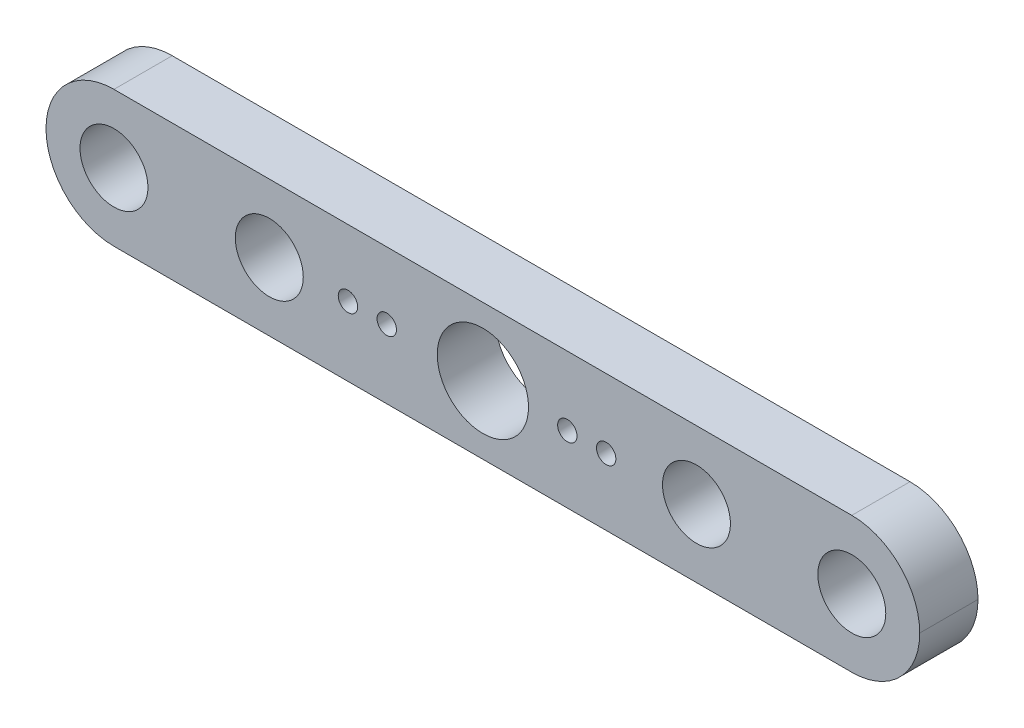
ISO-10303-21;
HEADER;
FILE_DESCRIPTION(('STEP AP214'),'2;1');
FILE_NAME('part.step','',(''),(''),'','','');
FILE_SCHEMA(('AUTOMOTIVE_DESIGN { 1 0 10303 214 1 1 1 1 }'));
ENDSEC;
DATA;
#1=APPLICATION_CONTEXT('core data for automotive mechanical design processes');
#2=APPLICATION_PROTOCOL_DEFINITION('international standard','automotive_design',2000,#1);
#3=PRODUCT_CONTEXT('',#1,'mechanical');
#4=PRODUCT('Part','Part','',(#3));
#5=PRODUCT_RELATED_PRODUCT_CATEGORY('part','',(#4));
#6=PRODUCT_DEFINITION_FORMATION('','',#4);
#7=PRODUCT_DEFINITION_CONTEXT('part definition',#1,'design');
#8=PRODUCT_DEFINITION('design','',#6,#7);
#9=PRODUCT_DEFINITION_SHAPE('','',#8);
#10=(LENGTH_UNIT() NAMED_UNIT(*) SI_UNIT(.MILLI.,.METRE.));
#11=(NAMED_UNIT(*) PLANE_ANGLE_UNIT() SI_UNIT($,.RADIAN.));
#12=(NAMED_UNIT(*) SI_UNIT($,.STERADIAN.) SOLID_ANGLE_UNIT());
#13=UNCERTAINTY_MEASURE_WITH_UNIT(LENGTH_MEASURE(1.E-05),#10,'distance_accuracy_value','');
#14=(GEOMETRIC_REPRESENTATION_CONTEXT(3) GLOBAL_UNCERTAINTY_ASSIGNED_CONTEXT((#13)) GLOBAL_UNIT_ASSIGNED_CONTEXT((#10,
#11,#12)) REPRESENTATION_CONTEXT('',''));
#15=CARTESIAN_POINT('',(0.,0.,0.));
#16=DIRECTION('',(0.,0.,1.));
#17=DIRECTION('',(1.,0.,0.));
#18=AXIS2_PLACEMENT_3D('',#15,#16,#17);
#19=CARTESIAN_POINT('',(0.,0.,0.));
#20=DIRECTION('',(0.,0.,1.));
#21=DIRECTION('',(1.,0.,0.));
#22=AXIS2_PLACEMENT_3D('',#19,#20,#21);
#23=PLANE('',#22);
#24=CARTESIAN_POINT('',(-4.84927563384823,24.1661612303614,0.));
#25=DIRECTION('',(0.,0.,1.));
#26=DIRECTION('',(1.,0.,0.));
#27=AXIS2_PLACEMENT_3D('',#24,#25,#26);
#28=CIRCLE('',#27,1.75);
#29=CARTESIAN_POINT('',(-3.09927563384823,24.1661612303614,0.));
#30=VERTEX_POINT('',#29);
#31=EDGE_CURVE('E160',#30,#30,#28,.T.);
#32=ORIENTED_EDGE('',*,*,#31,.T.);
#33=EDGE_LOOP('',(#32));
#34=FACE_BOUND('',#33,.T.);
#35=CARTESIAN_POINT('',(3.15072436615177,24.1661612303614,0.));
#36=DIRECTION('',(0.,0.,1.));
#37=DIRECTION('',(1.,0.,0.));
#38=AXIS2_PLACEMENT_3D('',#35,#36,#37);
#39=CIRCLE('',#38,3.5);
#40=CARTESIAN_POINT('',(3.15072436615177,27.6661612303614,0.));
#41=VERTEX_POINT('',#40);
#42=CARTESIAN_POINT('',(6.65072436615177,24.1661612303614,0.));
#43=VERTEX_POINT('',#42);
#44=EDGE_CURVE('E89',#41,#43,#39,.F.);
#45=ORIENTED_EDGE('',*,*,#44,.T.);
#46=CARTESIAN_POINT('',(3.15072436615177,24.1661612303614,0.));
#47=DIRECTION('',(0.,0.,1.));
#48=DIRECTION('',(1.,0.,0.));
#49=AXIS2_PLACEMENT_3D('',#46,#47,#48);
#50=CIRCLE('',#49,3.5);
#51=CARTESIAN_POINT('',(3.15072436615177,20.6661612303614,0.));
#52=VERTEX_POINT('',#51);
#53=EDGE_CURVE('E153',#43,#52,#50,.F.);
#54=ORIENTED_EDGE('',*,*,#53,.T.);
#55=DIRECTION('',(1.,0.,0.));
#56=VECTOR('',#55,1.);
#57=CARTESIAN_POINT('',(0.,20.6661612303614,0.));
#58=LINE('',#57,#56);
#59=CARTESIAN_POINT('',(-34.8492756338482,20.6661612303614,0.));
#60=VERTEX_POINT('',#59);
#61=EDGE_CURVE('E143',#60,#52,#58,.T.);
#62=ORIENTED_EDGE('',*,*,#61,.F.);
#63=CARTESIAN_POINT('',(-34.8492756338482,24.1661612303614,0.));
#64=DIRECTION('',(0.,0.,1.));
#65=DIRECTION('',(1.,0.,0.));
#66=AXIS2_PLACEMENT_3D('',#63,#64,#65);
#67=CIRCLE('',#66,3.5);
#68=CARTESIAN_POINT('',(-38.3492756338482,24.1661612303614,0.));
#69=VERTEX_POINT('',#68);
#70=EDGE_CURVE('E127',#60,#69,#67,.F.);
#71=ORIENTED_EDGE('',*,*,#70,.T.);
#72=CARTESIAN_POINT('',(-34.8492756338482,24.1661612303614,0.));
#73=DIRECTION('',(0.,0.,1.));
#74=DIRECTION('',(1.,0.,0.));
#75=AXIS2_PLACEMENT_3D('',#72,#73,#74);
#76=CIRCLE('',#75,3.5);
#77=CARTESIAN_POINT('',(-34.8492756338482,27.6661612303614,0.));
#78=VERTEX_POINT('',#77);
#79=EDGE_CURVE('E136',#69,#78,#76,.F.);
#80=ORIENTED_EDGE('',*,*,#79,.T.);
#81=DIRECTION('',(1.,0.,0.));
#82=VECTOR('',#81,1.);
#83=CARTESIAN_POINT('',(0.,27.6661612303614,0.));
#84=LINE('',#83,#82);
#85=EDGE_CURVE('E155',#78,#41,#84,.T.);
#86=ORIENTED_EDGE('',*,*,#85,.T.);
#87=EDGE_LOOP('',(#45,#54,#62,#71,#80,#86));
#88=FACE_BOUND('',#87,.T.);
#89=CARTESIAN_POINT('',(-26.8492756338482,24.1661612303614,0.));
#90=DIRECTION('',(0.,0.,1.));
#91=DIRECTION('',(1.,0.,0.));
#92=AXIS2_PLACEMENT_3D('',#89,#90,#91);
#93=CIRCLE('',#92,1.75);
#94=CARTESIAN_POINT('',(-25.0992756338482,24.1661612303614,0.));
#95=VERTEX_POINT('',#94);
#96=EDGE_CURVE('E156',#95,#95,#93,.T.);
#97=ORIENTED_EDGE('',*,*,#96,.T.);
#98=EDGE_LOOP('',(#97));
#99=FACE_BOUND('',#98,.T.);
#100=CARTESIAN_POINT('',(-15.8492756338482,24.1661612303614,0.));
#101=DIRECTION('',(0.,0.,-1.));
#102=DIRECTION('',(-1.,0.,0.));
#103=AXIS2_PLACEMENT_3D('',#100,#101,#102);
#104=CIRCLE('',#103,2.34999999999975);
#105=CARTESIAN_POINT('',(-18.199275633848,24.1661612303614,0.));
#106=VERTEX_POINT('',#105);
#107=EDGE_CURVE('E170',#106,#106,#104,.T.);
#108=ORIENTED_EDGE('',*,*,#107,.F.);
#109=EDGE_LOOP('',(#108));
#110=FACE_BOUND('',#109,.T.);
#111=CARTESIAN_POINT('',(-9.49959617218024,24.1023589257663,0.));
#112=DIRECTION('',(0.,0.,-1.));
#113=DIRECTION('',(-1.,0.,0.));
#114=AXIS2_PLACEMENT_3D('',#111,#112,#113);
#115=CIRCLE('',#114,0.49999999999982);
#116=CARTESIAN_POINT('',(-9.99959617218006,24.1023589257663,0.));
#117=VERTEX_POINT('',#116);
#118=EDGE_CURVE('E175',#117,#117,#115,.T.);
#119=ORIENTED_EDGE('',*,*,#118,.F.);
#120=EDGE_LOOP('',(#119));
#121=FACE_BOUND('',#120,.T.);
#122=CARTESIAN_POINT('',(-20.7990257653847,24.2158968851244,0.));
#123=DIRECTION('',(0.,0.,-1.));
#124=DIRECTION('',(-1.,0.,0.));
#125=AXIS2_PLACEMENT_3D('',#122,#123,#124);
#126=CIRCLE('',#125,0.499999999999686);
#127=CARTESIAN_POINT('',(-21.2990257653844,24.2158968851244,0.));
#128=VERTEX_POINT('',#127);
#129=EDGE_CURVE('E184',#128,#128,#126,.T.);
#130=ORIENTED_EDGE('',*,*,#129,.F.);
#131=EDGE_LOOP('',(#130));
#132=FACE_BOUND('',#131,.T.);
#133=CARTESIAN_POINT('',(-22.7989248084297,24.2359920991701,0.));
#134=DIRECTION('',(0.,0.,-1.));
#135=DIRECTION('',(-1.,0.,0.));
#136=AXIS2_PLACEMENT_3D('',#133,#134,#135);
#137=CIRCLE('',#136,0.499999999999662);
#138=CARTESIAN_POINT('',(-23.2989248084294,24.2359920991701,0.));
#139=VERTEX_POINT('',#138);
#140=EDGE_CURVE('E180',#139,#139,#137,.T.);
#141=ORIENTED_EDGE('',*,*,#140,.F.);
#142=EDGE_LOOP('',(#141));
#143=FACE_BOUND('',#142,.T.);
#144=CARTESIAN_POINT('',(-11.4994952152253,24.122454139812,0.));
#145=DIRECTION('',(0.,0.,-1.));
#146=DIRECTION('',(-1.,0.,0.));
#147=AXIS2_PLACEMENT_3D('',#144,#145,#146);
#148=CIRCLE('',#147,0.499999999999795);
#149=CARTESIAN_POINT('',(-11.9994952152251,24.122454139812,0.));
#150=VERTEX_POINT('',#149);
#151=EDGE_CURVE('E179',#150,#150,#148,.T.);
#152=ORIENTED_EDGE('',*,*,#151,.F.);
#153=EDGE_LOOP('',(#152));
#154=FACE_BOUND('',#153,.T.);
#155=CARTESIAN_POINT('',(-34.8492756338482,24.1661612303614,0.));
#156=DIRECTION('',(0.,0.,1.));
#157=DIRECTION('',(1.,0.,0.));
#158=AXIS2_PLACEMENT_3D('',#155,#156,#157);
#159=CIRCLE('',#158,1.75);
#160=CARTESIAN_POINT('',(-33.0992756338482,24.1661612303614,0.));
#161=VERTEX_POINT('',#160);
#162=EDGE_CURVE('E247',#161,#161,#159,.T.);
#163=ORIENTED_EDGE('',*,*,#162,.T.);
#164=EDGE_LOOP('',(#163));
#165=FACE_BOUND('',#164,.T.);
#166=CARTESIAN_POINT('',(3.15072436615177,24.1661612303614,0.));
#167=DIRECTION('',(0.,0.,1.));
#168=DIRECTION('',(1.,0.,0.));
#169=AXIS2_PLACEMENT_3D('',#166,#167,#168);
#170=CIRCLE('',#169,1.75);
#171=CARTESIAN_POINT('',(4.90072436615177,24.1661612303614,0.));
#172=VERTEX_POINT('',#171);
#173=EDGE_CURVE('E238',#172,#172,#170,.T.);
#174=ORIENTED_EDGE('',*,*,#173,.T.);
#175=EDGE_LOOP('',(#174));
#176=FACE_BOUND('',#175,.T.);
#177=ADVANCED_FACE('F71',(#34,#88,#99,#110,#121,#132,#143,#154,#165,#176),#23,.F.);
#178=CARTESIAN_POINT('',(0.,0.,3.));
#179=DIRECTION('',(0.,0.,1.));
#180=DIRECTION('',(1.,0.,0.));
#181=AXIS2_PLACEMENT_3D('',#178,#179,#180);
#182=PLANE('',#181);
#183=CARTESIAN_POINT('',(-4.84927563384823,24.1661612303614,3.));
#184=DIRECTION('',(0.,0.,1.));
#185=DIRECTION('',(1.,0.,0.));
#186=AXIS2_PLACEMENT_3D('',#183,#184,#185);
#187=CIRCLE('',#186,1.75);
#188=CARTESIAN_POINT('',(-3.09927563384823,24.1661612303614,3.));
#189=VERTEX_POINT('',#188);
#190=EDGE_CURVE('E259',#189,#189,#187,.T.);
#191=ORIENTED_EDGE('',*,*,#190,.F.);
#192=EDGE_LOOP('',(#191));
#193=FACE_BOUND('',#192,.T.);
#194=DIRECTION('',(1.,0.,0.));
#195=VECTOR('',#194,1.);
#196=CARTESIAN_POINT('',(0.,20.6661612303614,3.));
#197=LINE('',#196,#195);
#198=CARTESIAN_POINT('',(-34.8492756338482,20.6661612303614,3.));
#199=VERTEX_POINT('',#198);
#200=CARTESIAN_POINT('',(3.15072436615177,20.6661612303614,3.));
#201=VERTEX_POINT('',#200);
#202=EDGE_CURVE('E146',#199,#201,#197,.T.);
#203=ORIENTED_EDGE('',*,*,#202,.T.);
#204=CARTESIAN_POINT('',(3.15072436615177,24.1661612303614,3.));
#205=DIRECTION('',(0.,0.,1.));
#206=DIRECTION('',(1.,0.,0.));
#207=AXIS2_PLACEMENT_3D('',#204,#205,#206);
#208=CIRCLE('',#207,3.5);
#209=CARTESIAN_POINT('',(6.65072436615177,24.1661612303614,3.));
#210=VERTEX_POINT('',#209);
#211=EDGE_CURVE('E220',#201,#210,#208,.T.);
#212=ORIENTED_EDGE('',*,*,#211,.T.);
#213=CARTESIAN_POINT('',(3.15072436615177,24.1661612303614,3.));
#214=DIRECTION('',(0.,0.,1.));
#215=DIRECTION('',(1.,0.,0.));
#216=AXIS2_PLACEMENT_3D('',#213,#214,#215);
#217=CIRCLE('',#216,3.5);
#218=CARTESIAN_POINT('',(3.15072436615177,27.6661612303614,3.));
#219=VERTEX_POINT('',#218);
#220=EDGE_CURVE('E217',#210,#219,#217,.T.);
#221=ORIENTED_EDGE('',*,*,#220,.T.);
#222=DIRECTION('',(1.,0.,0.));
#223=VECTOR('',#222,1.);
#224=CARTESIAN_POINT('',(0.,27.6661612303614,3.));
#225=LINE('',#224,#223);
#226=CARTESIAN_POINT('',(-34.8492756338482,27.6661612303614,3.));
#227=VERTEX_POINT('',#226);
#228=EDGE_CURVE('E251',#227,#219,#225,.T.);
#229=ORIENTED_EDGE('',*,*,#228,.F.);
#230=CARTESIAN_POINT('',(-34.8492756338482,24.1661612303614,3.));
#231=DIRECTION('',(0.,0.,1.));
#232=DIRECTION('',(1.,0.,0.));
#233=AXIS2_PLACEMENT_3D('',#230,#231,#232);
#234=CIRCLE('',#233,3.5);
#235=CARTESIAN_POINT('',(-38.3492756338482,24.1661612303614,3.));
#236=VERTEX_POINT('',#235);
#237=EDGE_CURVE('E211',#227,#236,#234,.T.);
#238=ORIENTED_EDGE('',*,*,#237,.T.);
#239=CARTESIAN_POINT('',(-34.8492756338482,24.1661612303614,3.));
#240=DIRECTION('',(0.,0.,1.));
#241=DIRECTION('',(1.,0.,0.));
#242=AXIS2_PLACEMENT_3D('',#239,#240,#241);
#243=CIRCLE('',#242,3.5);
#244=EDGE_CURVE('E214',#236,#199,#243,.T.);
#245=ORIENTED_EDGE('',*,*,#244,.T.);
#246=EDGE_LOOP('',(#203,#212,#221,#229,#238,#245));
#247=FACE_BOUND('',#246,.T.);
#248=CARTESIAN_POINT('',(-26.8492756338482,24.1661612303614,3.));
#249=DIRECTION('',(0.,0.,1.));
#250=DIRECTION('',(1.,0.,0.));
#251=AXIS2_PLACEMENT_3D('',#248,#249,#250);
#252=CIRCLE('',#251,1.75);
#253=CARTESIAN_POINT('',(-25.0992756338482,24.1661612303614,3.));
#254=VERTEX_POINT('',#253);
#255=EDGE_CURVE('E163',#254,#254,#252,.T.);
#256=ORIENTED_EDGE('',*,*,#255,.F.);
#257=EDGE_LOOP('',(#256));
#258=FACE_BOUND('',#257,.T.);
#259=CARTESIAN_POINT('',(-15.8492756338482,24.1661612303614,3.));
#260=DIRECTION('',(0.,0.,1.));
#261=DIRECTION('',(1.,0.,0.));
#262=AXIS2_PLACEMENT_3D('',#259,#260,#261);
#263=CIRCLE('',#262,2.34999999999975);
#264=CARTESIAN_POINT('',(-13.4992756338485,24.1661612303614,3.));
#265=VERTEX_POINT('',#264);
#266=EDGE_CURVE('E174',#265,#265,#263,.T.);
#267=ORIENTED_EDGE('',*,*,#266,.F.);
#268=EDGE_LOOP('',(#267));
#269=FACE_BOUND('',#268,.T.);
#270=CARTESIAN_POINT('',(-9.49959617218024,24.1023589257663,3.));
#271=DIRECTION('',(0.,0.,1.));
#272=DIRECTION('',(1.,0.,0.));
#273=AXIS2_PLACEMENT_3D('',#270,#271,#272);
#274=CIRCLE('',#273,0.49999999999982);
#275=CARTESIAN_POINT('',(-8.99959617218042,24.1023589257663,3.));
#276=VERTEX_POINT('',#275);
#277=EDGE_CURVE('E149',#276,#276,#274,.T.);
#278=ORIENTED_EDGE('',*,*,#277,.F.);
#279=EDGE_LOOP('',(#278));
#280=FACE_BOUND('',#279,.T.);
#281=CARTESIAN_POINT('',(-20.7990257653847,24.2158968851244,3.));
#282=DIRECTION('',(0.,0.,1.));
#283=DIRECTION('',(1.,0.,0.));
#284=AXIS2_PLACEMENT_3D('',#281,#282,#283);
#285=CIRCLE('',#284,0.499999999999686);
#286=CARTESIAN_POINT('',(-20.299025765385,24.2158968851244,3.));
#287=VERTEX_POINT('',#286);
#288=EDGE_CURVE('E199',#287,#287,#285,.T.);
#289=ORIENTED_EDGE('',*,*,#288,.F.);
#290=EDGE_LOOP('',(#289));
#291=FACE_BOUND('',#290,.T.);
#292=CARTESIAN_POINT('',(-22.7989248084297,24.2359920991701,3.));
#293=DIRECTION('',(0.,0.,1.));
#294=DIRECTION('',(1.,0.,0.));
#295=AXIS2_PLACEMENT_3D('',#292,#293,#294);
#296=CIRCLE('',#295,0.499999999999662);
#297=CARTESIAN_POINT('',(-22.2989248084301,24.2359920991701,3.));
#298=VERTEX_POINT('',#297);
#299=EDGE_CURVE('E195',#298,#298,#296,.T.);
#300=ORIENTED_EDGE('',*,*,#299,.F.);
#301=EDGE_LOOP('',(#300));
#302=FACE_BOUND('',#301,.T.);
#303=CARTESIAN_POINT('',(-11.4994952152253,24.122454139812,3.));
#304=DIRECTION('',(0.,0.,1.));
#305=DIRECTION('',(1.,0.,0.));
#306=AXIS2_PLACEMENT_3D('',#303,#304,#305);
#307=CIRCLE('',#306,0.499999999999795);
#308=CARTESIAN_POINT('',(-10.9994952152255,24.122454139812,3.));
#309=VERTEX_POINT('',#308);
#310=EDGE_CURVE('E191',#309,#309,#307,.T.);
#311=ORIENTED_EDGE('',*,*,#310,.F.);
#312=EDGE_LOOP('',(#311));
#313=FACE_BOUND('',#312,.T.);
#314=CARTESIAN_POINT('',(-34.8492756338482,24.1661612303614,3.));
#315=DIRECTION('',(0.,0.,1.));
#316=DIRECTION('',(1.,0.,0.));
#317=AXIS2_PLACEMENT_3D('',#314,#315,#316);
#318=CIRCLE('',#317,1.75);
#319=CARTESIAN_POINT('',(-33.0992756338482,24.1661612303614,3.));
#320=VERTEX_POINT('',#319);
#321=EDGE_CURVE('E244',#320,#320,#318,.T.);
#322=ORIENTED_EDGE('',*,*,#321,.F.);
#323=EDGE_LOOP('',(#322));
#324=FACE_BOUND('',#323,.T.);
#325=CARTESIAN_POINT('',(3.15072436615177,24.1661612303614,3.));
#326=DIRECTION('',(0.,0.,1.));
#327=DIRECTION('',(1.,0.,0.));
#328=AXIS2_PLACEMENT_3D('',#325,#326,#327);
#329=CIRCLE('',#328,1.75);
#330=CARTESIAN_POINT('',(4.90072436615177,24.1661612303614,3.));
#331=VERTEX_POINT('',#330);
#332=EDGE_CURVE('E233',#331,#331,#329,.T.);
#333=ORIENTED_EDGE('',*,*,#332,.F.);
#334=EDGE_LOOP('',(#333));
#335=FACE_BOUND('',#334,.T.);
#336=ADVANCED_FACE('F269',(#193,#247,#258,#269,#280,#291,#302,#313,#324,#335),#182,.T.);
#337=CARTESIAN_POINT('',(-11.4994952152253,24.122454139812,14.));
#338=DIRECTION('',(0.,0.,-1.));
#339=DIRECTION('',(-1.,0.,0.));
#340=AXIS2_PLACEMENT_3D('',#337,#338,#339);
#341=CYLINDRICAL_SURFACE('',#340,0.499999999999795);
#342=ORIENTED_EDGE('',*,*,#310,.T.);
#343=EDGE_LOOP('',(#342));
#344=FACE_BOUND('',#343,.T.);
#345=ORIENTED_EDGE('',*,*,#151,.T.);
#346=EDGE_LOOP('',(#345));
#347=FACE_BOUND('',#346,.T.);
#348=ADVANCED_FACE('F272',(#344,#347),#341,.F.);
#349=CARTESIAN_POINT('',(-22.7989248084297,24.2359920991701,14.));
#350=DIRECTION('',(0.,0.,-1.));
#351=DIRECTION('',(-1.,0.,0.));
#352=AXIS2_PLACEMENT_3D('',#349,#350,#351);
#353=CYLINDRICAL_SURFACE('',#352,0.499999999999662);
#354=ORIENTED_EDGE('',*,*,#299,.T.);
#355=EDGE_LOOP('',(#354));
#356=FACE_BOUND('',#355,.T.);
#357=ORIENTED_EDGE('',*,*,#140,.T.);
#358=EDGE_LOOP('',(#357));
#359=FACE_BOUND('',#358,.T.);
#360=ADVANCED_FACE('F347',(#356,#359),#353,.F.);
#361=CARTESIAN_POINT('',(-20.7990257653847,24.2158968851244,14.));
#362=DIRECTION('',(0.,0.,-1.));
#363=DIRECTION('',(-1.,0.,0.));
#364=AXIS2_PLACEMENT_3D('',#361,#362,#363);
#365=CYLINDRICAL_SURFACE('',#364,0.499999999999686);
#366=ORIENTED_EDGE('',*,*,#288,.T.);
#367=EDGE_LOOP('',(#366));
#368=FACE_BOUND('',#367,.T.);
#369=ORIENTED_EDGE('',*,*,#129,.T.);
#370=EDGE_LOOP('',(#369));
#371=FACE_BOUND('',#370,.T.);
#372=ADVANCED_FACE('F345',(#368,#371),#365,.F.);
#373=CARTESIAN_POINT('',(-9.49959617218024,24.1023589257663,14.));
#374=DIRECTION('',(0.,0.,-1.));
#375=DIRECTION('',(-1.,0.,0.));
#376=AXIS2_PLACEMENT_3D('',#373,#374,#375);
#377=CYLINDRICAL_SURFACE('',#376,0.49999999999982);
#378=ORIENTED_EDGE('',*,*,#277,.T.);
#379=EDGE_LOOP('',(#378));
#380=FACE_BOUND('',#379,.T.);
#381=ORIENTED_EDGE('',*,*,#118,.T.);
#382=EDGE_LOOP('',(#381));
#383=FACE_BOUND('',#382,.T.);
#384=ADVANCED_FACE('F341',(#380,#383),#377,.F.);
#385=CARTESIAN_POINT('',(-15.8492756338482,24.1661612303614,10.));
#386=DIRECTION('',(0.,0.,-1.));
#387=DIRECTION('',(-1.,0.,0.));
#388=AXIS2_PLACEMENT_3D('',#385,#386,#387);
#389=CYLINDRICAL_SURFACE('',#388,2.34999999999975);
#390=ORIENTED_EDGE('',*,*,#266,.T.);
#391=EDGE_LOOP('',(#390));
#392=FACE_BOUND('',#391,.T.);
#393=ORIENTED_EDGE('',*,*,#107,.T.);
#394=EDGE_LOOP('',(#393));
#395=FACE_BOUND('',#394,.T.);
#396=ADVANCED_FACE('F336',(#392,#395),#389,.F.);
#397=CARTESIAN_POINT('',(-26.8492756338482,24.1661612303614,-4.50044572608876));
#398=DIRECTION('',(0.,0.,1.));
#399=DIRECTION('',(1.,0.,0.));
#400=AXIS2_PLACEMENT_3D('',#397,#398,#399);
#401=CYLINDRICAL_SURFACE('',#400,1.75);
#402=CARTESIAN_POINT('',(-25.0992756338482,24.1661612303614,3.));
#403=CARTESIAN_POINT('',(-25.0992756338482,24.1661612303614,2.96875));
#404=CARTESIAN_POINT('',(-25.0992756338482,24.1661612303614,2.9375));
#405=CARTESIAN_POINT('',(-25.0992756338482,24.1661612303614,2.875));
#406=CARTESIAN_POINT('',(-25.0992756338482,24.1661612303614,2.84375));
#407=CARTESIAN_POINT('',(-25.0992756338482,24.1661612303614,2.78125));
#408=CARTESIAN_POINT('',(-25.0992756338482,24.1661612303614,2.75));
#409=CARTESIAN_POINT('',(-25.0992756338482,24.1661612303614,2.6875));
#410=CARTESIAN_POINT('',(-25.0992756338482,24.1661612303614,2.65625));
#411=CARTESIAN_POINT('',(-25.0992756338482,24.1661612303614,2.59375));
#412=CARTESIAN_POINT('',(-25.0992756338482,24.1661612303614,2.5625));
#413=CARTESIAN_POINT('',(-25.0992756338482,24.1661612303614,2.5));
#414=CARTESIAN_POINT('',(-25.0992756338482,24.1661612303614,2.46875));
#415=CARTESIAN_POINT('',(-25.0992756338482,24.1661612303614,2.40625));
#416=CARTESIAN_POINT('',(-25.0992756338482,24.1661612303614,2.375));
#417=CARTESIAN_POINT('',(-25.0992756338482,24.1661612303614,2.3125));
#418=CARTESIAN_POINT('',(-25.0992756338482,24.1661612303614,2.28125));
#419=CARTESIAN_POINT('',(-25.0992756338482,24.1661612303614,2.21875));
#420=CARTESIAN_POINT('',(-25.0992756338482,24.1661612303614,2.1875));
#421=CARTESIAN_POINT('',(-25.0992756338482,24.1661612303614,2.125));
#422=CARTESIAN_POINT('',(-25.0992756338482,24.1661612303614,2.09375));
#423=CARTESIAN_POINT('',(-25.0992756338482,24.1661612303614,2.03125));
#424=CARTESIAN_POINT('',(-25.0992756338482,24.1661612303614,2.));
#425=CARTESIAN_POINT('',(-25.0992756338482,24.1661612303614,1.9375));
#426=CARTESIAN_POINT('',(-25.0992756338482,24.1661612303614,1.90625));
#427=CARTESIAN_POINT('',(-25.0992756338482,24.1661612303614,1.84375));
#428=CARTESIAN_POINT('',(-25.0992756338482,24.1661612303614,1.8125));
#429=CARTESIAN_POINT('',(-25.0992756338482,24.1661612303614,1.75));
#430=CARTESIAN_POINT('',(-25.0992756338482,24.1661612303614,1.71875));
#431=CARTESIAN_POINT('',(-25.0992756338482,24.1661612303614,1.65625));
#432=CARTESIAN_POINT('',(-25.0992756338482,24.1661612303614,1.625));
#433=CARTESIAN_POINT('',(-25.0992756338482,24.1661612303614,1.5625));
#434=CARTESIAN_POINT('',(-25.0992756338482,24.1661612303614,1.53125));
#435=CARTESIAN_POINT('',(-25.0992756338482,24.1661612303614,1.46875));
#436=CARTESIAN_POINT('',(-25.0992756338482,24.1661612303614,1.4375));
#437=CARTESIAN_POINT('',(-25.0992756338482,24.1661612303614,1.375));
#438=CARTESIAN_POINT('',(-25.0992756338482,24.1661612303614,1.34375));
#439=CARTESIAN_POINT('',(-25.0992756338482,24.1661612303614,1.28125));
#440=CARTESIAN_POINT('',(-25.0992756338482,24.1661612303614,1.25));
#441=CARTESIAN_POINT('',(-25.0992756338482,24.1661612303614,1.1875));
#442=CARTESIAN_POINT('',(-25.0992756338482,24.1661612303614,1.15625));
#443=CARTESIAN_POINT('',(-25.0992756338482,24.1661612303614,1.09375));
#444=CARTESIAN_POINT('',(-25.0992756338482,24.1661612303614,1.0625));
#445=CARTESIAN_POINT('',(-25.0992756338482,24.1661612303614,1.));
#446=CARTESIAN_POINT('',(-25.0992756338482,24.1661612303614,0.96875));
#447=CARTESIAN_POINT('',(-25.0992756338482,24.1661612303614,0.90625));
#448=CARTESIAN_POINT('',(-25.0992756338482,24.1661612303614,0.875));
#449=CARTESIAN_POINT('',(-25.0992756338482,24.1661612303614,0.8125));
#450=CARTESIAN_POINT('',(-25.0992756338482,24.1661612303614,0.78125));
#451=CARTESIAN_POINT('',(-25.0992756338482,24.1661612303614,0.71875));
#452=CARTESIAN_POINT('',(-25.0992756338482,24.1661612303614,0.6875));
#453=CARTESIAN_POINT('',(-25.0992756338482,24.1661612303614,0.625));
#454=CARTESIAN_POINT('',(-25.0992756338482,24.1661612303614,0.59375));
#455=CARTESIAN_POINT('',(-25.0992756338482,24.1661612303614,0.53125));
#456=CARTESIAN_POINT('',(-25.0992756338482,24.1661612303614,0.5));
#457=CARTESIAN_POINT('',(-25.0992756338482,24.1661612303614,0.4375));
#458=CARTESIAN_POINT('',(-25.0992756338482,24.1661612303614,0.40625));
#459=CARTESIAN_POINT('',(-25.0992756338482,24.1661612303614,0.343749999999999));
#460=CARTESIAN_POINT('',(-25.0992756338482,24.1661612303614,0.312499999999999));
#461=CARTESIAN_POINT('',(-25.0992756338482,24.1661612303614,0.249999999999999));
#462=CARTESIAN_POINT('',(-25.0992756338482,24.1661612303614,0.218749999999999));
#463=CARTESIAN_POINT('',(-25.0992756338482,24.1661612303614,0.156249999999999));
#464=CARTESIAN_POINT('',(-25.0992756338482,24.1661612303614,0.124999999999999));
#465=CARTESIAN_POINT('',(-25.0992756338482,24.1661612303614,0.0624999999999992));
#466=CARTESIAN_POINT('',(-25.0992756338482,24.1661612303614,0.0312499999999992));
#467=CARTESIAN_POINT('',(-25.0992756338482,24.1661612303614,0.));
#468=B_SPLINE_CURVE_WITH_KNOTS('',3,(#402,#403,#404,#405,#406,#407,#408,#409,#410,#411,#412,
#413,#414,#415,#416,#417,#418,#419,#420,#421,#422,#423,#424,#425,#426,#427,#428,#429,#430,#431,
#432,#433,#434,#435,#436,#437,#438,#439,#440,#441,#442,#443,#444,#445,#446,#447,#448,#449,#450,
#451,#452,#453,#454,#455,#456,#457,#458,#459,#460,#461,#462,#463,#464,#465,#466,#467),
.UNSPECIFIED.,.F.,.F.,(4,2,2,2,2,2,2,2,2,2,2,2,2,2,2,2,2,2,2,2,2,2,2,2,2,2,2,2,2,2,2,2,4),(0.,
0.0937500000000001,0.1875,0.28125,0.375,0.46875,0.5625,0.656250000000001,0.750000000000001,
0.843750000000001,0.9375,1.03125,1.125,1.21875,1.3125,1.40625,1.5,1.59375,1.6875,1.78125,1.875,
1.96875,2.0625,2.15625,2.25,2.34375,2.4375,2.53125,2.625,2.71875,2.8125,2.90625,3.),.UNSPECIFIED.);
#469=EDGE_CURVE('BSEAM266',#254,#95,#468,.T.);
#470=ORIENTED_EDGE('',*,*,#255,.T.);
#471=ORIENTED_EDGE('',*,*,#96,.F.);
#472=ORIENTED_EDGE('',*,*,#469,.T.);
#473=ORIENTED_EDGE('',*,*,#469,.F.);
#474=EDGE_LOOP('',(#470,#472,#471,#473));
#475=FACE_BOUND('',#474,.T.);
#476=ADVANCED_FACE('F266',(#475),#401,.F.);
#477=CARTESIAN_POINT('',(0.,27.6661612303614,-4.50044572608876));
#478=DIRECTION('',(0.,-1.,0.));
#479=DIRECTION('',(0.,0.,-1.));
#480=AXIS2_PLACEMENT_3D('',#477,#478,#479);
#481=PLANE('',#480);
#482=ORIENTED_EDGE('',*,*,#228,.T.);
#483=DIRECTION('',(0.,0.,1.));
#484=VECTOR('',#483,1.);
#485=CARTESIAN_POINT('',(3.15072436615177,27.6661612303614,0.));
#486=LINE('',#485,#484);
#487=EDGE_CURVE('E12',#219,#41,#486,.F.);
#488=ORIENTED_EDGE('',*,*,#487,.T.);
#489=ORIENTED_EDGE('',*,*,#85,.F.);
#490=DIRECTION('',(0.,0.,1.));
#491=VECTOR('',#490,1.);
#492=CARTESIAN_POINT('',(-34.8492756338482,27.6661612303614,3.));
#493=LINE('',#492,#491);
#494=EDGE_CURVE('E81',#78,#227,#493,.T.);
#495=ORIENTED_EDGE('',*,*,#494,.T.);
#496=EDGE_LOOP('',(#482,#488,#489,#495));
#497=FACE_BOUND('',#496,.T.);
#498=ADVANCED_FACE('F327',(#497),#481,.F.);
#499=CARTESIAN_POINT('',(0.,20.6661612303614,-4.50044572608876));
#500=DIRECTION('',(0.,-1.,0.));
#501=DIRECTION('',(0.,0.,-1.));
#502=AXIS2_PLACEMENT_3D('',#499,#500,#501);
#503=PLANE('',#502);
#504=ORIENTED_EDGE('',*,*,#61,.T.);
#505=DIRECTION('',(0.,0.,1.));
#506=VECTOR('',#505,1.);
#507=CARTESIAN_POINT('',(3.15072436615177,20.6661612303614,-4.50044572608876));
#508=LINE('',#507,#506);
#509=EDGE_CURVE('E148',#52,#201,#508,.T.);
#510=ORIENTED_EDGE('',*,*,#509,.T.);
#511=ORIENTED_EDGE('',*,*,#202,.F.);
#512=DIRECTION('',(0.,0.,1.));
#513=VECTOR('',#512,1.);
#514=CARTESIAN_POINT('',(-34.8492756338482,20.6661612303614,-4.50044572608876));
#515=LINE('',#514,#513);
#516=EDGE_CURVE('E131',#199,#60,#515,.F.);
#517=ORIENTED_EDGE('',*,*,#516,.T.);
#518=EDGE_LOOP('',(#504,#510,#511,#517));
#519=FACE_BOUND('',#518,.T.);
#520=ADVANCED_FACE('F141',(#519),#503,.T.);
#521=CARTESIAN_POINT('',(-4.84927563384823,24.1661612303614,-4.50044572608876));
#522=DIRECTION('',(0.,0.,1.));
#523=DIRECTION('',(1.,0.,0.));
#524=AXIS2_PLACEMENT_3D('',#521,#522,#523);
#525=CYLINDRICAL_SURFACE('',#524,1.75);
#526=CARTESIAN_POINT('',(-3.09927563384823,24.1661612303614,3.));
#527=CARTESIAN_POINT('',(-3.09927563384823,24.1661612303614,2.96875));
#528=CARTESIAN_POINT('',(-3.09927563384823,24.1661612303614,2.9375));
#529=CARTESIAN_POINT('',(-3.09927563384823,24.1661612303614,2.875));
#530=CARTESIAN_POINT('',(-3.09927563384823,24.1661612303614,2.84375));
#531=CARTESIAN_POINT('',(-3.09927563384823,24.1661612303614,2.78125));
#532=CARTESIAN_POINT('',(-3.09927563384823,24.1661612303614,2.75));
#533=CARTESIAN_POINT('',(-3.09927563384823,24.1661612303614,2.6875));
#534=CARTESIAN_POINT('',(-3.09927563384823,24.1661612303614,2.65625));
#535=CARTESIAN_POINT('',(-3.09927563384823,24.1661612303614,2.59375));
#536=CARTESIAN_POINT('',(-3.09927563384823,24.1661612303614,2.5625));
#537=CARTESIAN_POINT('',(-3.09927563384823,24.1661612303614,2.5));
#538=CARTESIAN_POINT('',(-3.09927563384823,24.1661612303614,2.46875));
#539=CARTESIAN_POINT('',(-3.09927563384823,24.1661612303614,2.40625));
#540=CARTESIAN_POINT('',(-3.09927563384823,24.1661612303614,2.375));
#541=CARTESIAN_POINT('',(-3.09927563384823,24.1661612303614,2.3125));
#542=CARTESIAN_POINT('',(-3.09927563384823,24.1661612303614,2.28125));
#543=CARTESIAN_POINT('',(-3.09927563384823,24.1661612303614,2.21875));
#544=CARTESIAN_POINT('',(-3.09927563384823,24.1661612303614,2.1875));
#545=CARTESIAN_POINT('',(-3.09927563384823,24.1661612303614,2.125));
#546=CARTESIAN_POINT('',(-3.09927563384823,24.1661612303614,2.09375));
#547=CARTESIAN_POINT('',(-3.09927563384823,24.1661612303614,2.03125));
#548=CARTESIAN_POINT('',(-3.09927563384823,24.1661612303614,2.));
#549=CARTESIAN_POINT('',(-3.09927563384823,24.1661612303614,1.9375));
#550=CARTESIAN_POINT('',(-3.09927563384823,24.1661612303614,1.90625));
#551=CARTESIAN_POINT('',(-3.09927563384823,24.1661612303614,1.84375));
#552=CARTESIAN_POINT('',(-3.09927563384823,24.1661612303614,1.8125));
#553=CARTESIAN_POINT('',(-3.09927563384823,24.1661612303614,1.75));
#554=CARTESIAN_POINT('',(-3.09927563384823,24.1661612303614,1.71875));
#555=CARTESIAN_POINT('',(-3.09927563384823,24.1661612303614,1.65625));
#556=CARTESIAN_POINT('',(-3.09927563384823,24.1661612303614,1.625));
#557=CARTESIAN_POINT('',(-3.09927563384823,24.1661612303614,1.5625));
#558=CARTESIAN_POINT('',(-3.09927563384823,24.1661612303614,1.53125));
#559=CARTESIAN_POINT('',(-3.09927563384823,24.1661612303614,1.46875));
#560=CARTESIAN_POINT('',(-3.09927563384823,24.1661612303614,1.4375));
#561=CARTESIAN_POINT('',(-3.09927563384823,24.1661612303614,1.375));
#562=CARTESIAN_POINT('',(-3.09927563384823,24.1661612303614,1.34375));
#563=CARTESIAN_POINT('',(-3.09927563384823,24.1661612303614,1.28125));
#564=CARTESIAN_POINT('',(-3.09927563384823,24.1661612303614,1.25));
#565=CARTESIAN_POINT('',(-3.09927563384823,24.1661612303614,1.1875));
#566=CARTESIAN_POINT('',(-3.09927563384823,24.1661612303614,1.15625));
#567=CARTESIAN_POINT('',(-3.09927563384823,24.1661612303614,1.09375));
#568=CARTESIAN_POINT('',(-3.09927563384823,24.1661612303614,1.0625));
#569=CARTESIAN_POINT('',(-3.09927563384823,24.1661612303614,1.));
#570=CARTESIAN_POINT('',(-3.09927563384823,24.1661612303614,0.96875));
#571=CARTESIAN_POINT('',(-3.09927563384823,24.1661612303614,0.90625));
#572=CARTESIAN_POINT('',(-3.09927563384823,24.1661612303614,0.875));
#573=CARTESIAN_POINT('',(-3.09927563384823,24.1661612303614,0.8125));
#574=CARTESIAN_POINT('',(-3.09927563384823,24.1661612303614,0.78125));
#575=CARTESIAN_POINT('',(-3.09927563384823,24.1661612303614,0.71875));
#576=CARTESIAN_POINT('',(-3.09927563384823,24.1661612303614,0.6875));
#577=CARTESIAN_POINT('',(-3.09927563384823,24.1661612303614,0.625));
#578=CARTESIAN_POINT('',(-3.09927563384823,24.1661612303614,0.59375));
#579=CARTESIAN_POINT('',(-3.09927563384823,24.1661612303614,0.53125));
#580=CARTESIAN_POINT('',(-3.09927563384823,24.1661612303614,0.5));
#581=CARTESIAN_POINT('',(-3.09927563384823,24.1661612303614,0.4375));
#582=CARTESIAN_POINT('',(-3.09927563384823,24.1661612303614,0.40625));
#583=CARTESIAN_POINT('',(-3.09927563384823,24.1661612303614,0.343749999999999));
#584=CARTESIAN_POINT('',(-3.09927563384823,24.1661612303614,0.312499999999999));
#585=CARTESIAN_POINT('',(-3.09927563384823,24.1661612303614,0.249999999999999));
#586=CARTESIAN_POINT('',(-3.09927563384823,24.1661612303614,0.218749999999999));
#587=CARTESIAN_POINT('',(-3.09927563384823,24.1661612303614,0.156249999999999));
#588=CARTESIAN_POINT('',(-3.09927563384823,24.1661612303614,0.124999999999999));
#589=CARTESIAN_POINT('',(-3.09927563384823,24.1661612303614,0.0624999999999992));
#590=CARTESIAN_POINT('',(-3.09927563384823,24.1661612303614,0.0312499999999992));
#591=CARTESIAN_POINT('',(-3.09927563384823,24.1661612303614,0.));
#592=B_SPLINE_CURVE_WITH_KNOTS('',3,(#526,#527,#528,#529,#530,#531,#532,#533,#534,#535,#536,
#537,#538,#539,#540,#541,#542,#543,#544,#545,#546,#547,#548,#549,#550,#551,#552,#553,#554,#555,
#556,#557,#558,#559,#560,#561,#562,#563,#564,#565,#566,#567,#568,#569,#570,#571,#572,#573,#574,
#575,#576,#577,#578,#579,#580,#581,#582,#583,#584,#585,#586,#587,#588,#589,#590,#591),
.UNSPECIFIED.,.F.,.F.,(4,2,2,2,2,2,2,2,2,2,2,2,2,2,2,2,2,2,2,2,2,2,2,2,2,2,2,2,2,2,2,2,4),(0.,
0.0937500000000001,0.1875,0.28125,0.375,0.46875,0.5625,0.656250000000001,0.750000000000001,
0.843750000000001,0.9375,1.03125,1.125,1.21875,1.3125,1.40625,1.5,1.59375,1.6875,1.78125,1.875,
1.96875,2.0625,2.15625,2.25,2.34375,2.4375,2.53125,2.625,2.71875,2.8125,2.90625,3.),.UNSPECIFIED.);
#593=EDGE_CURVE('BSEAM291',#189,#30,#592,.T.);
#594=ORIENTED_EDGE('',*,*,#190,.T.);
#595=ORIENTED_EDGE('',*,*,#31,.F.);
#596=ORIENTED_EDGE('',*,*,#593,.T.);
#597=ORIENTED_EDGE('',*,*,#593,.F.);
#598=EDGE_LOOP('',(#594,#596,#595,#597));
#599=FACE_BOUND('',#598,.T.);
#600=ADVANCED_FACE('F291',(#599),#525,.F.);
#601=CARTESIAN_POINT('',(-34.8492756338482,24.1661612303614,0.));
#602=DIRECTION('',(0.,0.,1.));
#603=DIRECTION('',(1.,0.,0.));
#604=AXIS2_PLACEMENT_3D('',#601,#602,#603);
#605=CYLINDRICAL_SURFACE('',#604,1.75);
#606=ORIENTED_EDGE('',*,*,#162,.F.);
#607=EDGE_LOOP('',(#606));
#608=FACE_BOUND('',#607,.T.);
#609=ORIENTED_EDGE('',*,*,#321,.T.);
#610=EDGE_LOOP('',(#609));
#611=FACE_BOUND('',#610,.T.);
#612=ADVANCED_FACE('F288',(#608,#611),#605,.F.);
#613=CARTESIAN_POINT('',(3.15072436615177,24.1661612303614,0.));
#614=DIRECTION('',(0.,0.,1.));
#615=DIRECTION('',(1.,0.,0.));
#616=AXIS2_PLACEMENT_3D('',#613,#614,#615);
#617=CYLINDRICAL_SURFACE('',#616,1.75);
#618=ORIENTED_EDGE('',*,*,#173,.F.);
#619=EDGE_LOOP('',(#618));
#620=FACE_BOUND('',#619,.T.);
#621=ORIENTED_EDGE('',*,*,#332,.T.);
#622=EDGE_LOOP('',(#621));
#623=FACE_BOUND('',#622,.T.);
#624=ADVANCED_FACE('F290',(#620,#623),#617,.F.);
#625=CARTESIAN_POINT('',(3.15072436615177,24.1661612303614,0.));
#626=DIRECTION('',(0.,0.,-1.));
#627=DIRECTION('',(-1.,0.,0.));
#628=AXIS2_PLACEMENT_3D('',#625,#626,#627);
#629=CYLINDRICAL_SURFACE('',#628,3.5);
#630=DIRECTION('',(0.,0.,1.));
#631=VECTOR('',#630,1.);
#632=CARTESIAN_POINT('',(6.65072436615177,24.1661612303614,3.));
#633=LINE('',#632,#631);
#634=EDGE_CURVE('E230',#43,#210,#633,.T.);
#635=ORIENTED_EDGE('',*,*,#634,.F.);
#636=ORIENTED_EDGE('',*,*,#44,.F.);
#637=ORIENTED_EDGE('',*,*,#487,.F.);
#638=ORIENTED_EDGE('',*,*,#220,.F.);
#639=EDGE_LOOP('',(#635,#636,#637,#638));
#640=FACE_BOUND('',#639,.T.);
#641=ADVANCED_FACE('F298',(#640),#629,.T.);
#642=CARTESIAN_POINT('',(3.15072436615177,24.1661612303614,-4.50044572608876));
#643=DIRECTION('',(0.,0.,1.));
#644=DIRECTION('',(1.,0.,0.));
#645=AXIS2_PLACEMENT_3D('',#642,#643,#644);
#646=CYLINDRICAL_SURFACE('',#645,3.5);
#647=ORIENTED_EDGE('',*,*,#53,.F.);
#648=ORIENTED_EDGE('',*,*,#634,.T.);
#649=ORIENTED_EDGE('',*,*,#211,.F.);
#650=ORIENTED_EDGE('',*,*,#509,.F.);
#651=EDGE_LOOP('',(#647,#648,#649,#650));
#652=FACE_BOUND('',#651,.T.);
#653=ADVANCED_FACE('F312',(#652),#646,.T.);
#654=CARTESIAN_POINT('',(-34.8492756338482,24.1661612303614,-4.50044572608876));
#655=DIRECTION('',(0.,0.,-1.));
#656=DIRECTION('',(-1.,0.,0.));
#657=AXIS2_PLACEMENT_3D('',#654,#655,#656);
#658=CYLINDRICAL_SURFACE('',#657,3.5);
#659=ORIENTED_EDGE('',*,*,#494,.F.);
#660=ORIENTED_EDGE('',*,*,#79,.F.);
#661=DIRECTION('',(0.,0.,1.));
#662=VECTOR('',#661,1.);
#663=CARTESIAN_POINT('',(-38.3492756338482,24.1661612303614,0.));
#664=LINE('',#663,#662);
#665=EDGE_CURVE('E75',#236,#69,#664,.F.);
#666=ORIENTED_EDGE('',*,*,#665,.F.);
#667=ORIENTED_EDGE('',*,*,#237,.F.);
#668=EDGE_LOOP('',(#659,#660,#666,#667));
#669=FACE_BOUND('',#668,.T.);
#670=ADVANCED_FACE('F73',(#669),#658,.T.);
#671=CARTESIAN_POINT('',(-34.8492756338482,24.1661612303614,0.));
#672=DIRECTION('',(0.,0.,1.));
#673=DIRECTION('',(1.,0.,0.));
#674=AXIS2_PLACEMENT_3D('',#671,#672,#673);
#675=CYLINDRICAL_SURFACE('',#674,3.5);
#676=ORIENTED_EDGE('',*,*,#70,.F.);
#677=ORIENTED_EDGE('',*,*,#516,.F.);
#678=ORIENTED_EDGE('',*,*,#244,.F.);
#679=ORIENTED_EDGE('',*,*,#665,.T.);
#680=EDGE_LOOP('',(#676,#677,#678,#679));
#681=FACE_BOUND('',#680,.T.);
#682=ADVANCED_FACE('F129',(#681),#675,.T.);
#683=CLOSED_SHELL('',(#177,#336,#348,#360,#372,#384,#396,#476,#498,#520,#600,#612,#624,#641,
#653,#670,#682));
#684=MANIFOLD_SOLID_BREP('B2',#683);
#685=ADVANCED_BREP_SHAPE_REPRESENTATION('',(#18,#684),#14);
#686=SHAPE_DEFINITION_REPRESENTATION(#9,#685);
ENDSEC;
END-ISO-10303-21;
